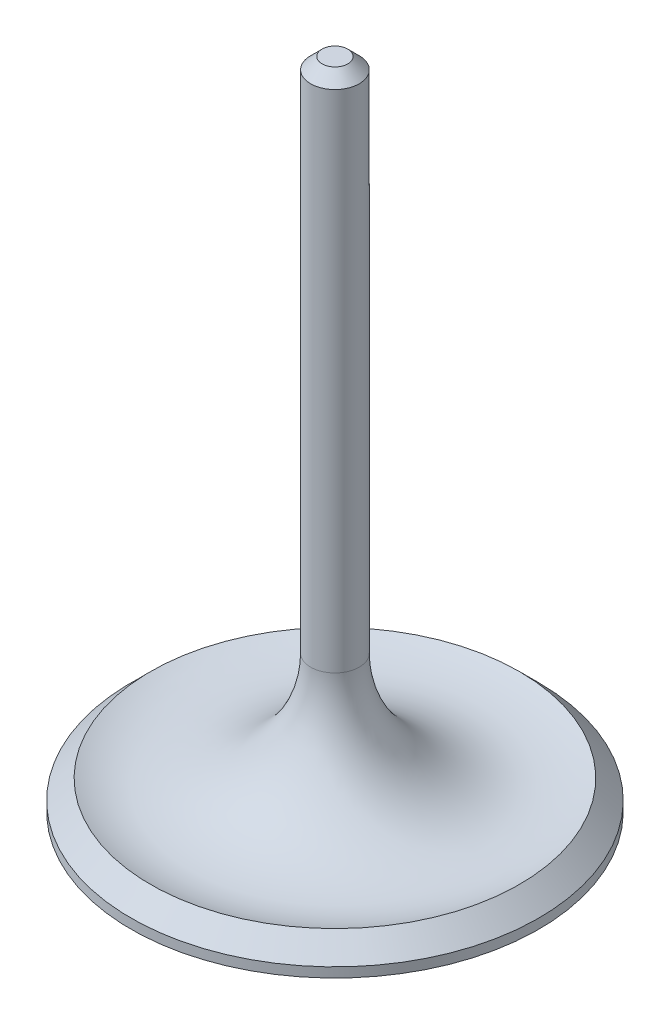
ISO-10303-21;
HEADER;
FILE_DESCRIPTION(('STEP AP214'),'2;1');
FILE_NAME('part.step','',(''),(''),'','','');
FILE_SCHEMA(('AUTOMOTIVE_DESIGN { 1 0 10303 214 1 1 1 1 }'));
ENDSEC;
DATA;
#1=APPLICATION_CONTEXT('core data for automotive mechanical design processes');
#2=APPLICATION_PROTOCOL_DEFINITION('international standard','automotive_design',2000,#1);
#3=PRODUCT_CONTEXT('',#1,'mechanical');
#4=PRODUCT('Part','Part','',(#3));
#5=PRODUCT_RELATED_PRODUCT_CATEGORY('part','',(#4));
#6=PRODUCT_DEFINITION_FORMATION('','',#4);
#7=PRODUCT_DEFINITION_CONTEXT('part definition',#1,'design');
#8=PRODUCT_DEFINITION('design','',#6,#7);
#9=PRODUCT_DEFINITION_SHAPE('','',#8);
#10=(LENGTH_UNIT() NAMED_UNIT(*) SI_UNIT(.MILLI.,.METRE.));
#11=(NAMED_UNIT(*) PLANE_ANGLE_UNIT() SI_UNIT($,.RADIAN.));
#12=(NAMED_UNIT(*) SI_UNIT($,.STERADIAN.) SOLID_ANGLE_UNIT());
#13=UNCERTAINTY_MEASURE_WITH_UNIT(LENGTH_MEASURE(1.E-05),#10,'distance_accuracy_value','');
#14=(GEOMETRIC_REPRESENTATION_CONTEXT(3) GLOBAL_UNCERTAINTY_ASSIGNED_CONTEXT((#13)) GLOBAL_UNIT_ASSIGNED_CONTEXT((#10,
#11,#12)) REPRESENTATION_CONTEXT('',''));
#15=CARTESIAN_POINT('',(0.,0.,0.));
#16=DIRECTION('',(0.,0.,1.));
#17=DIRECTION('',(1.,0.,0.));
#18=AXIS2_PLACEMENT_3D('',#15,#16,#17);
#19=CARTESIAN_POINT('',(26.67,0.,0.));
#20=DIRECTION('',(0.,-1.,0.));
#21=DIRECTION('',(0.,0.,-1.));
#22=AXIS2_PLACEMENT_3D('',#19,#20,#21);
#23=PLANE('',#22);
#24=CARTESIAN_POINT('',(0.,0.,0.));
#25=DIRECTION('',(0.,-1.,0.));
#26=DIRECTION('',(0.,0.,-1.));
#27=AXIS2_PLACEMENT_3D('',#24,#25,#26);
#28=CIRCLE('',#27,26.67);
#29=CARTESIAN_POINT('',(0.,0.,-26.67));
#30=VERTEX_POINT('',#29);
#31=EDGE_CURVE('E56',#30,#30,#28,.T.);
#32=ORIENTED_EDGE('',*,*,#31,.T.);
#33=EDGE_LOOP('',(#32));
#34=FACE_BOUND('',#33,.T.);
#35=ADVANCED_FACE('F42',(#34),#23,.T.);
#36=CARTESIAN_POINT('',(0.,0.,0.));
#37=DIRECTION('',(0.,-1.,0.));
#38=DIRECTION('',(0.,0.,-1.));
#39=AXIS2_PLACEMENT_3D('',#36,#37,#38);
#40=CYLINDRICAL_SURFACE('',#39,26.67);
#41=CARTESIAN_POINT('',(0.,1.27,0.));
#42=DIRECTION('',(0.,-1.,0.));
#43=DIRECTION('',(0.,0.,-1.));
#44=AXIS2_PLACEMENT_3D('',#41,#42,#43);
#45=CIRCLE('',#44,26.67);
#46=CARTESIAN_POINT('',(0.,1.27,-26.67));
#47=VERTEX_POINT('',#46);
#48=EDGE_CURVE('E61',#47,#47,#45,.T.);
#49=ORIENTED_EDGE('',*,*,#48,.T.);
#50=EDGE_LOOP('',(#49));
#51=FACE_BOUND('',#50,.T.);
#52=ORIENTED_EDGE('',*,*,#31,.F.);
#53=EDGE_LOOP('',(#52));
#54=FACE_BOUND('',#53,.T.);
#55=ADVANCED_FACE('F92',(#51,#54),#40,.T.);
#56=CARTESIAN_POINT('',(0.,1.27,0.));
#57=DIRECTION('',(0.,-1.,0.));
#58=DIRECTION('',(0.,0.,-1.));
#59=AXIS2_PLACEMENT_3D('',#56,#57,#58);
#60=CONICAL_SURFACE('',#59,26.67,0.785398163397454);
#61=CARTESIAN_POINT('',(0.,3.81,0.));
#62=DIRECTION('',(0.,-1.,0.));
#63=DIRECTION('',(0.,0.,-1.));
#64=AXIS2_PLACEMENT_3D('',#61,#62,#63);
#65=CIRCLE('',#64,24.13);
#66=CARTESIAN_POINT('',(0.,3.81,-24.13));
#67=VERTEX_POINT('',#66);
#68=EDGE_CURVE('E67',#67,#67,#65,.T.);
#69=ORIENTED_EDGE('',*,*,#68,.T.);
#70=EDGE_LOOP('',(#69));
#71=FACE_BOUND('',#70,.T.);
#72=ORIENTED_EDGE('',*,*,#48,.F.);
#73=EDGE_LOOP('',(#72));
#74=FACE_BOUND('',#73,.T.);
#75=ADVANCED_FACE('F89',(#71,#74),#60,.T.);
#76=CARTESIAN_POINT('',(0.,17.9546986535592,0.));
#77=DIRECTION('',(0.,-1.,0.));
#78=DIRECTION('',(0.,0.,-1.));
#79=AXIS2_PLACEMENT_3D('',#76,#77,#78);
#80=TOROIDAL_SURFACE('',#79,18.43,15.25);
#81=CARTESIAN_POINT('',(0.,17.9546986535592,0.));
#82=DIRECTION('',(0.,-1.,0.));
#83=DIRECTION('',(0.,0.,-1.));
#84=AXIS2_PLACEMENT_3D('',#81,#82,#83);
#85=CIRCLE('',#84,3.18000000000001);
#86=CARTESIAN_POINT('',(0.,17.9546986535592,-3.18000000000001));
#87=VERTEX_POINT('',#86);
#88=EDGE_CURVE('E71',#87,#87,#85,.T.);
#89=ORIENTED_EDGE('',*,*,#88,.T.);
#90=EDGE_LOOP('',(#89));
#91=FACE_BOUND('',#90,.T.);
#92=ORIENTED_EDGE('',*,*,#68,.F.);
#93=EDGE_LOOP('',(#92));
#94=FACE_BOUND('',#93,.T.);
#95=ADVANCED_FACE('F76',(#91,#94),#80,.F.);
#96=CARTESIAN_POINT('',(0.,0.,0.));
#97=DIRECTION('',(0.,-1.,0.));
#98=DIRECTION('',(0.,0.,-1.));
#99=AXIS2_PLACEMENT_3D('',#96,#97,#98);
#100=CYLINDRICAL_SURFACE('',#99,3.18);
#101=CARTESIAN_POINT('',(0.,84.05,0.));
#102=DIRECTION('',(0.,1.,0.));
#103=DIRECTION('',(0.,0.,1.));
#104=AXIS2_PLACEMENT_3D('',#101,#102,#103);
#105=CIRCLE('',#104,3.18);
#106=CARTESIAN_POINT('',(0.,84.05,3.18));
#107=VERTEX_POINT('',#106);
#108=EDGE_CURVE('E51',#107,#107,#105,.F.);
#109=ORIENTED_EDGE('',*,*,#108,.T.);
#110=EDGE_LOOP('',(#109));
#111=FACE_BOUND('',#110,.T.);
#112=ORIENTED_EDGE('',*,*,#88,.F.);
#113=EDGE_LOOP('',(#112));
#114=FACE_BOUND('',#113,.T.);
#115=ADVANCED_FACE('F79',(#111,#114),#100,.T.);
#116=CARTESIAN_POINT('',(0.,85.55,0.));
#117=DIRECTION('',(0.,1.,0.));
#118=DIRECTION('',(0.,0.,1.));
#119=AXIS2_PLACEMENT_3D('',#116,#117,#118);
#120=PLANE('',#119);
#121=CARTESIAN_POINT('',(0.,85.55,0.));
#122=DIRECTION('',(0.,1.,0.));
#123=DIRECTION('',(0.,0.,1.));
#124=AXIS2_PLACEMENT_3D('',#121,#122,#123);
#125=CIRCLE('',#124,1.68);
#126=CARTESIAN_POINT('',(0.,85.55,1.68));
#127=VERTEX_POINT('',#126);
#128=EDGE_CURVE('E10',#127,#127,#125,.T.);
#129=ORIENTED_EDGE('',*,*,#128,.T.);
#130=EDGE_LOOP('',(#129));
#131=FACE_BOUND('',#130,.T.);
#132=ADVANCED_FACE('F81',(#131),#120,.T.);
#133=CARTESIAN_POINT('',(0.,84.05,0.));
#134=DIRECTION('',(0.,-1.,0.));
#135=DIRECTION('',(0.,0.,-1.));
#136=AXIS2_PLACEMENT_3D('',#133,#134,#135);
#137=CONICAL_SURFACE('',#136,3.18,0.785398163397449);
#138=ORIENTED_EDGE('',*,*,#128,.F.);
#139=EDGE_LOOP('',(#138));
#140=FACE_BOUND('',#139,.T.);
#141=ORIENTED_EDGE('',*,*,#108,.F.);
#142=EDGE_LOOP('',(#141));
#143=FACE_BOUND('',#142,.T.);
#144=ADVANCED_FACE('F45',(#140,#143),#137,.T.);
#145=CLOSED_SHELL('',(#35,#55,#75,#95,#115,#132,#144));
#146=MANIFOLD_SOLID_BREP('B2',#145);
#147=ADVANCED_BREP_SHAPE_REPRESENTATION('',(#18,#146),#14);
#148=SHAPE_DEFINITION_REPRESENTATION(#9,#147);
ENDSEC;
END-ISO-10303-21;
